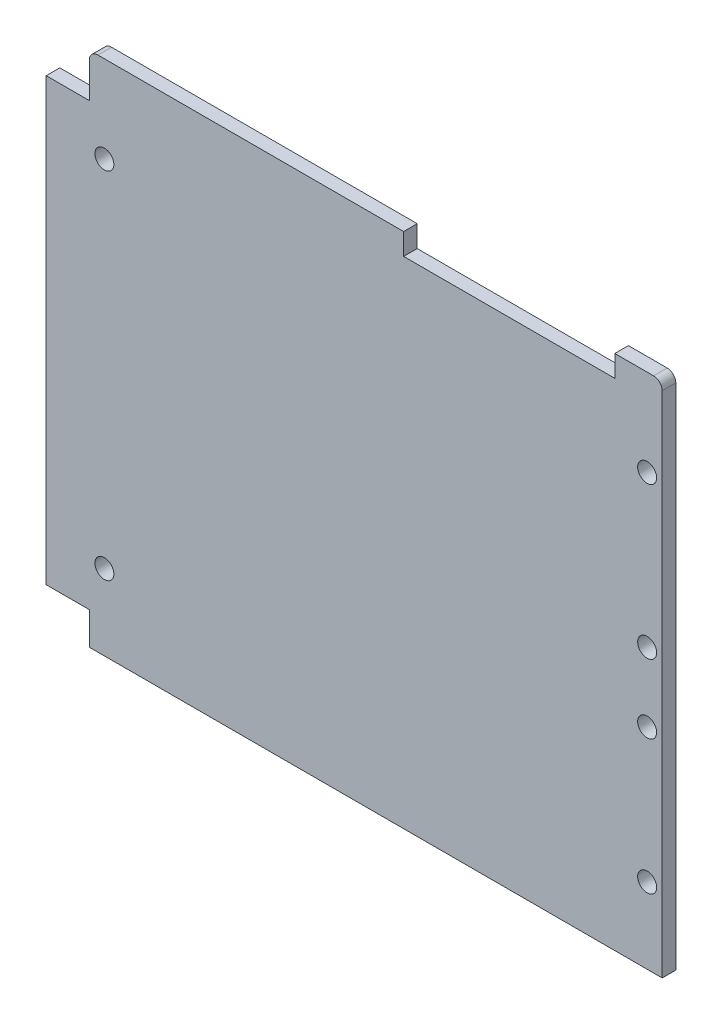
ISO-10303-21;
HEADER;
FILE_DESCRIPTION(('STEP AP214'),'2;1');
FILE_NAME('part.step','',(''),(''),'','','');
FILE_SCHEMA(('AUTOMOTIVE_DESIGN { 1 0 10303 214 1 1 1 1 }'));
ENDSEC;
DATA;
#1=APPLICATION_CONTEXT('core data for automotive mechanical design processes');
#2=APPLICATION_PROTOCOL_DEFINITION('international standard','automotive_design',2000,#1);
#3=PRODUCT_CONTEXT('',#1,'mechanical');
#4=PRODUCT('Part','Part','',(#3));
#5=PRODUCT_RELATED_PRODUCT_CATEGORY('part','',(#4));
#6=PRODUCT_DEFINITION_FORMATION('','',#4);
#7=PRODUCT_DEFINITION_CONTEXT('part definition',#1,'design');
#8=PRODUCT_DEFINITION('design','',#6,#7);
#9=PRODUCT_DEFINITION_SHAPE('','',#8);
#10=(LENGTH_UNIT() NAMED_UNIT(*) SI_UNIT(.MILLI.,.METRE.));
#11=(NAMED_UNIT(*) PLANE_ANGLE_UNIT() SI_UNIT($,.RADIAN.));
#12=(NAMED_UNIT(*) SI_UNIT($,.STERADIAN.) SOLID_ANGLE_UNIT());
#13=UNCERTAINTY_MEASURE_WITH_UNIT(LENGTH_MEASURE(1.E-05),#10,'distance_accuracy_value','');
#14=(GEOMETRIC_REPRESENTATION_CONTEXT(3) GLOBAL_UNCERTAINTY_ASSIGNED_CONTEXT((#13)) GLOBAL_UNIT_ASSIGNED_CONTEXT((#10,
#11,#12)) REPRESENTATION_CONTEXT('',''));
#15=CARTESIAN_POINT('',(0.,0.,0.));
#16=DIRECTION('',(0.,0.,1.));
#17=DIRECTION('',(1.,0.,0.));
#18=AXIS2_PLACEMENT_3D('',#15,#16,#17);
#19=CARTESIAN_POINT('',(50.0729843246072,67.1204329614403,-1.5748));
#20=DIRECTION('',(0.,1.,0.));
#21=DIRECTION('',(0.,0.,1.));
#22=AXIS2_PLACEMENT_3D('',#19,#20,#21);
#23=PLANE('',#22);
#24=DIRECTION('',(0.,0.,1.));
#25=VECTOR('',#24,1.);
#26=CARTESIAN_POINT('',(85.5429843246057,67.1204329614429,-1.575));
#27=LINE('',#26,#25);
#28=CARTESIAN_POINT('',(85.5429843246057,67.1204329614429,-1.5748));
#29=VERTEX_POINT('',#28);
#30=CARTESIAN_POINT('',(85.5429843246057,67.1204329614429,0.));
#31=VERTEX_POINT('',#30);
#32=EDGE_CURVE('E181',#29,#31,#27,.T.);
#33=ORIENTED_EDGE('',*,*,#32,.F.);
#34=DIRECTION('',(-1.,0.,0.));
#35=VECTOR('',#34,1.);
#36=CARTESIAN_POINT('',(50.0729843246072,67.1204329614403,-1.5748));
#37=LINE('',#36,#35);
#38=CARTESIAN_POINT('',(50.0729843246072,67.1204329614403,-1.5748));
#39=VERTEX_POINT('',#38);
#40=EDGE_CURVE('E289',#29,#39,#37,.T.);
#41=ORIENTED_EDGE('',*,*,#40,.T.);
#42=DIRECTION('',(0.,0.,1.));
#43=VECTOR('',#42,1.);
#44=CARTESIAN_POINT('',(50.0729843246072,67.1204329614403,-1.5748));
#45=LINE('',#44,#43);
#46=CARTESIAN_POINT('',(50.0729843246072,67.1204329614403,0.));
#47=VERTEX_POINT('',#46);
#48=EDGE_CURVE('E43',#39,#47,#45,.T.);
#49=ORIENTED_EDGE('',*,*,#48,.T.);
#50=DIRECTION('',(-1.,0.,0.));
#51=VECTOR('',#50,1.);
#52=CARTESIAN_POINT('',(50.0729843246072,67.1204329614403,0.));
#53=LINE('',#52,#51);
#54=EDGE_CURVE('E301',#31,#47,#53,.T.);
#55=ORIENTED_EDGE('',*,*,#54,.F.);
#56=EDGE_LOOP('',(#33,#41,#49,#55));
#57=FACE_BOUND('',#56,.T.);
#58=ADVANCED_FACE('F34',(#57),#23,.T.);
#59=CARTESIAN_POINT('',(49.0729843246072,66.1204329614403,-1.5748));
#60=DIRECTION('',(-1.,0.,0.));
#61=DIRECTION('',(0.,-1.,0.));
#62=AXIS2_PLACEMENT_3D('',#59,#60,#61);
#63=PLANE('',#62);
#64=DIRECTION('',(0.,0.,1.));
#65=VECTOR('',#64,1.);
#66=CARTESIAN_POINT('',(49.0729843245987,10.8954329614369,-1.575));
#67=LINE('',#66,#65);
#68=CARTESIAN_POINT('',(49.0729843245987,10.8954329614369,-1.575));
#69=VERTEX_POINT('',#68);
#70=CARTESIAN_POINT('',(49.0729843246072,10.8954329614369,0.));
#71=VERTEX_POINT('',#70);
#72=EDGE_CURVE('E211',#69,#71,#67,.T.);
#73=ORIENTED_EDGE('',*,*,#72,.F.);
#74=DIRECTION('',(0.,-1.,0.));
#75=VECTOR('',#74,1.);
#76=CARTESIAN_POINT('',(49.0729843246072,6.62043296144033,-1.575));
#77=LINE('',#76,#75);
#78=CARTESIAN_POINT('',(49.0729843246072,7.12043296144033,-1.575));
#79=VERTEX_POINT('',#78);
#80=EDGE_CURVE('E268',#69,#79,#77,.T.);
#81=ORIENTED_EDGE('',*,*,#80,.T.);
#82=DIRECTION('',(0.,0.,1.));
#83=VECTOR('',#82,1.);
#84=CARTESIAN_POINT('',(49.0729843246072,7.12043296144033,-1.575));
#85=LINE('',#84,#83);
#86=CARTESIAN_POINT('',(49.0729843246072,7.12043296144033,0.));
#87=VERTEX_POINT('',#86);
#88=EDGE_CURVE('E265',#79,#87,#85,.T.);
#89=ORIENTED_EDGE('',*,*,#88,.T.);
#90=DIRECTION('',(0.,-1.,0.));
#91=VECTOR('',#90,1.);
#92=CARTESIAN_POINT('',(49.0729843246072,66.1204329614403,0.));
#93=LINE('',#92,#91);
#94=EDGE_CURVE('E306',#71,#87,#93,.T.);
#95=ORIENTED_EDGE('',*,*,#94,.F.);
#96=EDGE_LOOP('',(#73,#81,#89,#95));
#97=FACE_BOUND('',#96,.T.);
#98=ADVANCED_FACE('F327',(#97),#63,.T.);
#99=DIRECTION('',(0.,0.,1.));
#100=VECTOR('',#99,1.);
#101=CARTESIAN_POINT('',(49.0729843245987,62.0454329614404,-1.575));
#102=LINE('',#101,#100);
#103=CARTESIAN_POINT('',(49.0729843246072,62.0454329614404,-1.5748));
#104=VERTEX_POINT('',#103);
#105=CARTESIAN_POINT('',(49.0729843246072,62.0454329614404,0.));
#106=VERTEX_POINT('',#105);
#107=EDGE_CURVE('E203',#104,#106,#102,.T.);
#108=ORIENTED_EDGE('',*,*,#107,.T.);
#109=CARTESIAN_POINT('',(49.0729843246072,66.1204329614403,0.));
#110=VERTEX_POINT('',#109);
#111=EDGE_CURVE('E286',#110,#106,#93,.T.);
#112=ORIENTED_EDGE('',*,*,#111,.F.);
#113=DIRECTION('',(0.,0.,1.));
#114=VECTOR('',#113,1.);
#115=CARTESIAN_POINT('',(49.0729843246072,66.1204329614403,-1.5748));
#116=LINE('',#115,#114);
#117=CARTESIAN_POINT('',(49.0729843246072,66.1204329614403,-1.5748));
#118=VERTEX_POINT('',#117);
#119=EDGE_CURVE('E11',#118,#110,#116,.T.);
#120=ORIENTED_EDGE('',*,*,#119,.F.);
#121=DIRECTION('',(0.,-1.,0.));
#122=VECTOR('',#121,1.);
#123=CARTESIAN_POINT('',(49.0729843246072,66.1204329614403,-1.5748));
#124=LINE('',#123,#122);
#125=EDGE_CURVE('E296',#118,#104,#124,.T.);
#126=ORIENTED_EDGE('',*,*,#125,.T.);
#127=EDGE_LOOP('',(#108,#112,#120,#126));
#128=FACE_BOUND('',#127,.T.);
#129=ADVANCED_FACE('F349',(#128),#63,.T.);
#130=CARTESIAN_POINT('',(50.0729843246072,66.1204329614403,-1.5748));
#131=DIRECTION('',(0.,0.,1.));
#132=DIRECTION('',(1.,0.,0.));
#133=AXIS2_PLACEMENT_3D('',#130,#131,#132);
#134=CYLINDRICAL_SURFACE('',#133,0.999999999999994);
#135=CARTESIAN_POINT('',(50.0729843246072,66.1204329614403,0.));
#136=DIRECTION('',(0.,0.,1.));
#137=DIRECTION('',(1.,0.,0.));
#138=AXIS2_PLACEMENT_3D('',#135,#136,#137);
#139=CIRCLE('',#138,0.999999999999994);
#140=EDGE_CURVE('E303',#47,#110,#139,.T.);
#141=ORIENTED_EDGE('',*,*,#140,.F.);
#142=ORIENTED_EDGE('',*,*,#48,.F.);
#143=CARTESIAN_POINT('',(50.0729843246072,66.1204329614403,-1.5748));
#144=DIRECTION('',(0.,0.,1.));
#145=DIRECTION('',(1.,0.,0.));
#146=AXIS2_PLACEMENT_3D('',#143,#144,#145);
#147=CIRCLE('',#146,0.999999999999994);
#148=EDGE_CURVE('E293',#39,#118,#147,.T.);
#149=ORIENTED_EDGE('',*,*,#148,.T.);
#150=ORIENTED_EDGE('',*,*,#119,.T.);
#151=EDGE_LOOP('',(#141,#142,#149,#150));
#152=FACE_BOUND('',#151,.T.);
#153=ADVANCED_FACE('F354',(#152),#134,.T.);
#154=DIRECTION('',(0.,0.,1.));
#155=VECTOR('',#154,1.);
#156=CARTESIAN_POINT('',(110.0429843246,67.1204329614429,-1.575));
#157=LINE('',#156,#155);
#158=CARTESIAN_POINT('',(110.0429843246,67.1204329614429,-1.5748));
#159=VERTEX_POINT('',#158);
#160=CARTESIAN_POINT('',(110.0429843246,67.1204329614429,0.));
#161=VERTEX_POINT('',#160);
#162=EDGE_CURVE('E163',#159,#161,#157,.T.);
#163=ORIENTED_EDGE('',*,*,#162,.T.);
#164=CARTESIAN_POINT('',(114.542984324607,67.1204329614403,0.));
#165=VERTEX_POINT('',#164);
#166=EDGE_CURVE('E176',#165,#161,#53,.T.);
#167=ORIENTED_EDGE('',*,*,#166,.F.);
#168=DIRECTION('',(0.,0.,1.));
#169=VECTOR('',#168,1.);
#170=CARTESIAN_POINT('',(114.542984324607,67.1204329614403,-1.5748));
#171=LINE('',#170,#169);
#172=CARTESIAN_POINT('',(114.542984324607,67.1204329614403,-1.5748));
#173=VERTEX_POINT('',#172);
#174=EDGE_CURVE('E310',#173,#165,#171,.T.);
#175=ORIENTED_EDGE('',*,*,#174,.F.);
#176=EDGE_CURVE('E290',#173,#159,#37,.T.);
#177=ORIENTED_EDGE('',*,*,#176,.T.);
#178=EDGE_LOOP('',(#163,#167,#175,#177));
#179=FACE_BOUND('',#178,.T.);
#180=ADVANCED_FACE('F390',(#179),#23,.T.);
#181=CARTESIAN_POINT('',(114.542984324607,66.1204329614403,-1.5748));
#182=DIRECTION('',(0.,0.,1.));
#183=DIRECTION('',(1.,0.,0.));
#184=AXIS2_PLACEMENT_3D('',#181,#182,#183);
#185=CYLINDRICAL_SURFACE('',#184,1.);
#186=CARTESIAN_POINT('',(114.542984324607,66.1204329614403,0.));
#187=DIRECTION('',(0.,0.,1.));
#188=DIRECTION('',(-1.,0.,0.));
#189=AXIS2_PLACEMENT_3D('',#186,#187,#188);
#190=CIRCLE('',#189,1.);
#191=CARTESIAN_POINT('',(115.542984324607,66.1204329614403,0.));
#192=VERTEX_POINT('',#191);
#193=EDGE_CURVE('E299',#192,#165,#190,.T.);
#194=ORIENTED_EDGE('',*,*,#193,.F.);
#195=DIRECTION('',(0.,0.,1.));
#196=VECTOR('',#195,1.);
#197=CARTESIAN_POINT('',(115.542984324607,66.1204329614403,-1.5748));
#198=LINE('',#197,#196);
#199=CARTESIAN_POINT('',(115.542984324607,66.1204329614403,-1.5748));
#200=VERTEX_POINT('',#199);
#201=EDGE_CURVE('E38',#200,#192,#198,.T.);
#202=ORIENTED_EDGE('',*,*,#201,.F.);
#203=CARTESIAN_POINT('',(114.542984324607,66.1204329614403,-1.5748));
#204=DIRECTION('',(0.,0.,1.));
#205=DIRECTION('',(-1.,0.,0.));
#206=AXIS2_PLACEMENT_3D('',#203,#204,#205);
#207=CIRCLE('',#206,1.);
#208=EDGE_CURVE('E285',#200,#173,#207,.T.);
#209=ORIENTED_EDGE('',*,*,#208,.T.);
#210=ORIENTED_EDGE('',*,*,#174,.T.);
#211=EDGE_LOOP('',(#194,#202,#209,#210));
#212=FACE_BOUND('',#211,.T.);
#213=ADVANCED_FACE('F320',(#212),#185,.T.);
#214=CARTESIAN_POINT('',(115.542984324607,66.1204329614403,-1.5748));
#215=DIRECTION('',(1.,0.,0.));
#216=DIRECTION('',(0.,1.,0.));
#217=AXIS2_PLACEMENT_3D('',#214,#215,#216);
#218=PLANE('',#217);
#219=DIRECTION('',(0.,0.,1.));
#220=VECTOR('',#219,1.);
#221=CARTESIAN_POINT('',(115.542984324607,7.12043296144033,-1.575));
#222=LINE('',#221,#220);
#223=CARTESIAN_POINT('',(115.542984324607,7.12043296144033,-1.575));
#224=VERTEX_POINT('',#223);
#225=CARTESIAN_POINT('',(115.542984324607,7.12043296144033,0.));
#226=VERTEX_POINT('',#225);
#227=EDGE_CURVE('E262',#224,#226,#222,.T.);
#228=ORIENTED_EDGE('',*,*,#227,.F.);
#229=DIRECTION('',(0.,1.,0.));
#230=VECTOR('',#229,1.);
#231=CARTESIAN_POINT('',(115.542984324607,6.62043296144033,-1.575));
#232=LINE('',#231,#230);
#233=CARTESIAN_POINT('',(115.542984324607,11.9563849575794,-1.575));
#234=VERTEX_POINT('',#233);
#235=EDGE_CURVE('E271',#224,#234,#232,.T.);
#236=ORIENTED_EDGE('',*,*,#235,.T.);
#237=DIRECTION('',(0.,0.,1.));
#238=VECTOR('',#237,1.);
#239=CARTESIAN_POINT('',(115.542984324607,11.9563849575794,-1.575));
#240=LINE('',#239,#238);
#241=CARTESIAN_POINT('',(115.542984324607,11.9563849575794,-1.5748));
#242=VERTEX_POINT('',#241);
#243=EDGE_CURVE('E275',#234,#242,#240,.T.);
#244=ORIENTED_EDGE('',*,*,#243,.T.);
#245=DIRECTION('',(0.,1.,0.));
#246=VECTOR('',#245,1.);
#247=CARTESIAN_POINT('',(115.542984324607,66.1204329614403,-1.5748));
#248=LINE('',#247,#246);
#249=EDGE_CURVE('E283',#242,#200,#248,.T.);
#250=ORIENTED_EDGE('',*,*,#249,.T.);
#251=ORIENTED_EDGE('',*,*,#201,.T.);
#252=DIRECTION('',(0.,1.,0.));
#253=VECTOR('',#252,1.);
#254=CARTESIAN_POINT('',(115.542984324607,66.1204329614403,0.));
#255=LINE('',#254,#253);
#256=EDGE_CURVE('E282',#226,#192,#255,.T.);
#257=ORIENTED_EDGE('',*,*,#256,.F.);
#258=EDGE_LOOP('',(#228,#236,#244,#250,#251,#257));
#259=FACE_BOUND('',#258,.T.);
#260=ADVANCED_FACE('F36',(#259),#218,.T.);
#261=CARTESIAN_POINT('',(114.542984324607,7.62043296144033,-1.5748));
#262=DIRECTION('',(0.,0.,1.));
#263=DIRECTION('',(1.,0.,0.));
#264=AXIS2_PLACEMENT_3D('',#261,#262,#263);
#265=PLANE('',#264);
#266=ORIENTED_EDGE('',*,*,#40,.F.);
#267=DIRECTION('',(0.,-1.,0.));
#268=VECTOR('',#267,1.);
#269=CARTESIAN_POINT('',(85.5429843246057,7.62043296144033,-1.5748));
#270=LINE('',#269,#268);
#271=CARTESIAN_POINT('',(85.5429843246057,64.620432961444,-1.5748));
#272=VERTEX_POINT('',#271);
#273=EDGE_CURVE('E187',#29,#272,#270,.T.);
#274=ORIENTED_EDGE('',*,*,#273,.T.);
#275=DIRECTION('',(1.,0.,0.));
#276=VECTOR('',#275,1.);
#277=CARTESIAN_POINT('',(114.542984324607,64.620432961444,-1.5748));
#278=LINE('',#277,#276);
#279=CARTESIAN_POINT('',(110.0429843246,64.620432961444,-1.5748));
#280=VERTEX_POINT('',#279);
#281=EDGE_CURVE('E183',#272,#280,#278,.T.);
#282=ORIENTED_EDGE('',*,*,#281,.T.);
#283=DIRECTION('',(0.,1.,0.));
#284=VECTOR('',#283,1.);
#285=CARTESIAN_POINT('',(110.0429843246,7.62043296144033,-1.5748));
#286=LINE('',#285,#284);
#287=EDGE_CURVE('E160',#280,#159,#286,.T.);
#288=ORIENTED_EDGE('',*,*,#287,.T.);
#289=ORIENTED_EDGE('',*,*,#176,.F.);
#290=ORIENTED_EDGE('',*,*,#208,.F.);
#291=ORIENTED_EDGE('',*,*,#249,.F.);
#292=DIRECTION('',(-1.,0.,0.));
#293=VECTOR('',#292,1.);
#294=CARTESIAN_POINT('',(114.542984324607,11.9563849575794,-1.5748));
#295=LINE('',#294,#293);
#296=CARTESIAN_POINT('',(49.0729843246072,11.9563849575794,-1.5748));
#297=VERTEX_POINT('',#296);
#298=EDGE_CURVE('E278',#242,#297,#295,.T.);
#299=ORIENTED_EDGE('',*,*,#298,.T.);
#300=DIRECTION('',(0.,1.,0.));
#301=VECTOR('',#300,1.);
#302=CARTESIAN_POINT('',(49.0729843245987,7.62043296144033,-1.5748));
#303=LINE('',#302,#301);
#304=EDGE_CURVE('E59',#297,#104,#303,.T.);
#305=ORIENTED_EDGE('',*,*,#304,.T.);
#306=ORIENTED_EDGE('',*,*,#125,.F.);
#307=ORIENTED_EDGE('',*,*,#148,.F.);
#308=EDGE_LOOP('',(#266,#274,#282,#288,#289,#290,#291,#299,#305,#306,#307));
#309=FACE_BOUND('',#308,.T.);
#310=CARTESIAN_POINT('',(50.8229843246072,15.8954329614404,-1.5748));
#311=DIRECTION('',(0.,0.,1.));
#312=DIRECTION('',(1.,0.,0.));
#313=AXIS2_PLACEMENT_3D('',#310,#311,#312);
#314=CIRCLE('',#313,1.09999999999999);
#315=CARTESIAN_POINT('',(51.9229843246072,15.8954329614404,-1.5748));
#316=VERTEX_POINT('',#315);
#317=EDGE_CURVE('E225',#316,#316,#314,.T.);
#318=ORIENTED_EDGE('',*,*,#317,.T.);
#319=EDGE_LOOP('',(#318));
#320=FACE_BOUND('',#319,.T.);
#321=CARTESIAN_POINT('',(50.8229843246072,57.0454329614403,-1.5748));
#322=DIRECTION('',(0.,0.,1.));
#323=DIRECTION('',(1.,0.,0.));
#324=AXIS2_PLACEMENT_3D('',#321,#322,#323);
#325=CIRCLE('',#324,1.09999999999999);
#326=CARTESIAN_POINT('',(51.9229843246072,57.0454329614403,-1.5748));
#327=VERTEX_POINT('',#326);
#328=EDGE_CURVE('E231',#327,#327,#325,.T.);
#329=ORIENTED_EDGE('',*,*,#328,.T.);
#330=EDGE_LOOP('',(#329));
#331=FACE_BOUND('',#330,.T.);
#332=CARTESIAN_POINT('',(113.792984324607,57.0454329614403,-1.5748));
#333=DIRECTION('',(0.,0.,1.));
#334=DIRECTION('',(1.,0.,0.));
#335=AXIS2_PLACEMENT_3D('',#332,#333,#334);
#336=CIRCLE('',#335,1.09999999999999);
#337=CARTESIAN_POINT('',(114.892984324607,57.0454329614403,-1.5748));
#338=VERTEX_POINT('',#337);
#339=EDGE_CURVE('E237',#338,#338,#336,.T.);
#340=ORIENTED_EDGE('',*,*,#339,.T.);
#341=EDGE_LOOP('',(#340));
#342=FACE_BOUND('',#341,.T.);
#343=CARTESIAN_POINT('',(113.792984324607,39.4704329614403,-1.5748));
#344=DIRECTION('',(0.,0.,1.));
#345=DIRECTION('',(1.,0.,0.));
#346=AXIS2_PLACEMENT_3D('',#343,#344,#345);
#347=CIRCLE('',#346,1.09999999999999);
#348=CARTESIAN_POINT('',(114.892984324607,39.4704329614403,-1.5748));
#349=VERTEX_POINT('',#348);
#350=EDGE_CURVE('E243',#349,#349,#347,.T.);
#351=ORIENTED_EDGE('',*,*,#350,.T.);
#352=EDGE_LOOP('',(#351));
#353=FACE_BOUND('',#352,.T.);
#354=CARTESIAN_POINT('',(113.792984324607,15.8954329614404,-1.5748));
#355=DIRECTION('',(0.,0.,1.));
#356=DIRECTION('',(1.,0.,0.));
#357=AXIS2_PLACEMENT_3D('',#354,#355,#356);
#358=CIRCLE('',#357,1.09999999999999);
#359=CARTESIAN_POINT('',(114.892984324607,15.8954329614404,-1.5748));
#360=VERTEX_POINT('',#359);
#361=EDGE_CURVE('E249',#360,#360,#358,.T.);
#362=ORIENTED_EDGE('',*,*,#361,.T.);
#363=EDGE_LOOP('',(#362));
#364=FACE_BOUND('',#363,.T.);
#365=CARTESIAN_POINT('',(113.792984324607,31.4704329614403,-1.5748));
#366=DIRECTION('',(0.,0.,1.));
#367=DIRECTION('',(1.,0.,0.));
#368=AXIS2_PLACEMENT_3D('',#365,#366,#367);
#369=CIRCLE('',#368,1.09999999999999);
#370=CARTESIAN_POINT('',(114.892984324607,31.4704329614403,-1.5748));
#371=VERTEX_POINT('',#370);
#372=EDGE_CURVE('E255',#371,#371,#369,.T.);
#373=ORIENTED_EDGE('',*,*,#372,.T.);
#374=EDGE_LOOP('',(#373));
#375=FACE_BOUND('',#374,.T.);
#376=ADVANCED_FACE('F357',(#309,#320,#331,#342,#353,#364,#375),#265,.F.);
#377=CARTESIAN_POINT('',(114.542984324607,7.62043296144033,0.));
#378=DIRECTION('',(0.,0.,1.));
#379=DIRECTION('',(1.,0.,0.));
#380=AXIS2_PLACEMENT_3D('',#377,#378,#379);
#381=PLANE('',#380);
#382=DIRECTION('',(0.,-1.,0.));
#383=VECTOR('',#382,1.);
#384=CARTESIAN_POINT('',(85.5429843246057,64.620432961444,0.));
#385=LINE('',#384,#383);
#386=CARTESIAN_POINT('',(85.5429843246057,64.620432961444,0.));
#387=VERTEX_POINT('',#386);
#388=EDGE_CURVE('E51',#31,#387,#385,.T.);
#389=ORIENTED_EDGE('',*,*,#388,.F.);
#390=ORIENTED_EDGE('',*,*,#54,.T.);
#391=ORIENTED_EDGE('',*,*,#140,.T.);
#392=ORIENTED_EDGE('',*,*,#111,.T.);
#393=DIRECTION('',(-1.,0.,0.));
#394=VECTOR('',#393,1.);
#395=CARTESIAN_POINT('',(49.0729843245987,62.0454329614404,0.));
#396=LINE('',#395,#394);
#397=CARTESIAN_POINT('',(44.0729843246038,62.0454329614404,0.));
#398=VERTEX_POINT('',#397);
#399=EDGE_CURVE('E190',#106,#398,#396,.T.);
#400=ORIENTED_EDGE('',*,*,#399,.T.);
#401=DIRECTION('',(0.,-1.,0.));
#402=VECTOR('',#401,1.);
#403=CARTESIAN_POINT('',(44.0729843246038,62.0454329614404,0.));
#404=LINE('',#403,#402);
#405=CARTESIAN_POINT('',(44.0729843246038,10.8954329614369,0.));
#406=VERTEX_POINT('',#405);
#407=EDGE_CURVE('E206',#398,#406,#404,.T.);
#408=ORIENTED_EDGE('',*,*,#407,.T.);
#409=DIRECTION('',(1.,0.,0.));
#410=VECTOR('',#409,1.);
#411=CARTESIAN_POINT('',(49.0729843245987,10.8954329614369,0.));
#412=LINE('',#411,#410);
#413=EDGE_CURVE('E194',#406,#71,#412,.T.);
#414=ORIENTED_EDGE('',*,*,#413,.T.);
#415=ORIENTED_EDGE('',*,*,#94,.T.);
#416=DIRECTION('',(-1.,0.,0.));
#417=VECTOR('',#416,1.);
#418=CARTESIAN_POINT('',(49.0729843246072,7.12043296144033,0.));
#419=LINE('',#418,#417);
#420=EDGE_CURVE('E258',#226,#87,#419,.T.);
#421=ORIENTED_EDGE('',*,*,#420,.F.);
#422=ORIENTED_EDGE('',*,*,#256,.T.);
#423=ORIENTED_EDGE('',*,*,#193,.T.);
#424=ORIENTED_EDGE('',*,*,#166,.T.);
#425=DIRECTION('',(0.,1.,0.));
#426=VECTOR('',#425,1.);
#427=CARTESIAN_POINT('',(110.0429843246,64.620432961444,0.));
#428=LINE('',#427,#426);
#429=CARTESIAN_POINT('',(110.0429843246,64.620432961444,0.));
#430=VERTEX_POINT('',#429);
#431=EDGE_CURVE('E157',#430,#161,#428,.T.);
#432=ORIENTED_EDGE('',*,*,#431,.F.);
#433=DIRECTION('',(1.,0.,0.));
#434=VECTOR('',#433,1.);
#435=CARTESIAN_POINT('',(85.5429843246057,64.620432961444,0.));
#436=LINE('',#435,#434);
#437=EDGE_CURVE('E167',#387,#430,#436,.T.);
#438=ORIENTED_EDGE('',*,*,#437,.F.);
#439=EDGE_LOOP('',(#389,#390,#391,#392,#400,#408,#414,#415,#421,#422,#423,#424,#432,#438));
#440=FACE_BOUND('',#439,.T.);
#441=CARTESIAN_POINT('',(50.8229843246072,15.8954329614404,0.));
#442=DIRECTION('',(0.,0.,-1.));
#443=DIRECTION('',(0.,1.,0.));
#444=AXIS2_PLACEMENT_3D('',#441,#442,#443);
#445=CIRCLE('',#444,1.09999999999999);
#446=CARTESIAN_POINT('',(50.8229843246072,16.9954329614404,0.));
#447=VERTEX_POINT('',#446);
#448=EDGE_CURVE('E222',#447,#447,#445,.T.);
#449=ORIENTED_EDGE('',*,*,#448,.T.);
#450=EDGE_LOOP('',(#449));
#451=FACE_BOUND('',#450,.T.);
#452=CARTESIAN_POINT('',(50.8229843246072,57.0454329614403,0.));
#453=DIRECTION('',(0.,0.,-1.));
#454=DIRECTION('',(0.,1.,0.));
#455=AXIS2_PLACEMENT_3D('',#452,#453,#454);
#456=CIRCLE('',#455,1.09999999999999);
#457=CARTESIAN_POINT('',(50.8229843246072,58.1454329614403,0.));
#458=VERTEX_POINT('',#457);
#459=EDGE_CURVE('E228',#458,#458,#456,.T.);
#460=ORIENTED_EDGE('',*,*,#459,.T.);
#461=EDGE_LOOP('',(#460));
#462=FACE_BOUND('',#461,.T.);
#463=CARTESIAN_POINT('',(113.792984324607,57.0454329614403,0.));
#464=DIRECTION('',(0.,0.,-1.));
#465=DIRECTION('',(0.,1.,0.));
#466=AXIS2_PLACEMENT_3D('',#463,#464,#465);
#467=CIRCLE('',#466,1.09999999999999);
#468=CARTESIAN_POINT('',(113.792984324607,58.1454329614403,0.));
#469=VERTEX_POINT('',#468);
#470=EDGE_CURVE('E234',#469,#469,#467,.T.);
#471=ORIENTED_EDGE('',*,*,#470,.T.);
#472=EDGE_LOOP('',(#471));
#473=FACE_BOUND('',#472,.T.);
#474=CARTESIAN_POINT('',(113.792984324607,39.4704329614403,0.));
#475=DIRECTION('',(0.,0.,-1.));
#476=DIRECTION('',(0.,1.,0.));
#477=AXIS2_PLACEMENT_3D('',#474,#475,#476);
#478=CIRCLE('',#477,1.09999999999999);
#479=CARTESIAN_POINT('',(113.792984324607,40.5704329614403,0.));
#480=VERTEX_POINT('',#479);
#481=EDGE_CURVE('E240',#480,#480,#478,.T.);
#482=ORIENTED_EDGE('',*,*,#481,.T.);
#483=EDGE_LOOP('',(#482));
#484=FACE_BOUND('',#483,.T.);
#485=CARTESIAN_POINT('',(113.792984324607,15.8954329614404,0.));
#486=DIRECTION('',(0.,0.,-1.));
#487=DIRECTION('',(0.,1.,0.));
#488=AXIS2_PLACEMENT_3D('',#485,#486,#487);
#489=CIRCLE('',#488,1.09999999999999);
#490=CARTESIAN_POINT('',(113.792984324607,16.9954329614404,0.));
#491=VERTEX_POINT('',#490);
#492=EDGE_CURVE('E246',#491,#491,#489,.T.);
#493=ORIENTED_EDGE('',*,*,#492,.T.);
#494=EDGE_LOOP('',(#493));
#495=FACE_BOUND('',#494,.T.);
#496=CARTESIAN_POINT('',(113.792984324607,31.4704329614403,0.));
#497=DIRECTION('',(0.,0.,-1.));
#498=DIRECTION('',(0.,1.,0.));
#499=AXIS2_PLACEMENT_3D('',#496,#497,#498);
#500=CIRCLE('',#499,1.09999999999999);
#501=CARTESIAN_POINT('',(113.792984324607,32.5704329614403,0.));
#502=VERTEX_POINT('',#501);
#503=EDGE_CURVE('E252',#502,#502,#500,.T.);
#504=ORIENTED_EDGE('',*,*,#503,.T.);
#505=EDGE_LOOP('',(#504));
#506=FACE_BOUND('',#505,.T.);
#507=ADVANCED_FACE('F172',(#440,#451,#462,#473,#484,#495,#506),#381,.T.);
#508=CARTESIAN_POINT('',(49.0729843246072,11.9563849575794,-1.575));
#509=DIRECTION('',(0.,1.,0.));
#510=DIRECTION('',(0.,0.,1.));
#511=AXIS2_PLACEMENT_3D('',#508,#509,#510);
#512=PLANE('',#511);
#513=ORIENTED_EDGE('',*,*,#298,.F.);
#514=ORIENTED_EDGE('',*,*,#243,.F.);
#515=DIRECTION('',(-1.,0.,0.));
#516=VECTOR('',#515,1.);
#517=CARTESIAN_POINT('',(49.0729843246072,11.9563849575794,-1.575));
#518=LINE('',#517,#516);
#519=CARTESIAN_POINT('',(49.0729843246072,11.9563849575794,-1.575));
#520=VERTEX_POINT('',#519);
#521=EDGE_CURVE('E273',#234,#520,#518,.T.);
#522=ORIENTED_EDGE('',*,*,#521,.T.);
#523=DIRECTION('',(0.,0.,1.));
#524=VECTOR('',#523,1.);
#525=CARTESIAN_POINT('',(49.0729843246072,11.9563849575794,-1.575));
#526=LINE('',#525,#524);
#527=EDGE_CURVE('E276',#520,#297,#526,.T.);
#528=ORIENTED_EDGE('',*,*,#527,.T.);
#529=EDGE_LOOP('',(#513,#514,#522,#528));
#530=FACE_BOUND('',#529,.T.);
#531=ADVANCED_FACE('F336',(#530),#512,.T.);
#532=CARTESIAN_POINT('',(0.,0.,-1.575));
#533=DIRECTION('',(0.,0.,-1.));
#534=DIRECTION('',(-1.,0.,0.));
#535=AXIS2_PLACEMENT_3D('',#532,#533,#534);
#536=PLANE('',#535);
#537=DIRECTION('',(-1.,0.,0.));
#538=VECTOR('',#537,1.);
#539=CARTESIAN_POINT('',(49.0729843246072,7.12043296144033,-1.575));
#540=LINE('',#539,#538);
#541=EDGE_CURVE('E259',#224,#79,#540,.T.);
#542=ORIENTED_EDGE('',*,*,#541,.T.);
#543=ORIENTED_EDGE('',*,*,#80,.F.);
#544=DIRECTION('',(1.,0.,0.));
#545=VECTOR('',#544,1.);
#546=CARTESIAN_POINT('',(49.0729843245987,10.8954329614369,-1.575));
#547=LINE('',#546,#545);
#548=CARTESIAN_POINT('',(44.0729843246038,10.8954329614369,-1.575));
#549=VERTEX_POINT('',#548);
#550=EDGE_CURVE('E200',#549,#69,#547,.T.);
#551=ORIENTED_EDGE('',*,*,#550,.F.);
#552=DIRECTION('',(0.,-1.,0.));
#553=VECTOR('',#552,1.);
#554=CARTESIAN_POINT('',(44.0729843246038,62.0454329614404,-1.575));
#555=LINE('',#554,#553);
#556=CARTESIAN_POINT('',(44.0729843246038,62.0454329614404,-1.575));
#557=VERTEX_POINT('',#556);
#558=EDGE_CURVE('E197',#557,#549,#555,.T.);
#559=ORIENTED_EDGE('',*,*,#558,.F.);
#560=DIRECTION('',(-1.,0.,0.));
#561=VECTOR('',#560,1.);
#562=CARTESIAN_POINT('',(49.0729843245987,62.0454329614404,-1.575));
#563=LINE('',#562,#561);
#564=CARTESIAN_POINT('',(49.0729843245987,62.0454329614404,-1.575));
#565=VERTEX_POINT('',#564);
#566=EDGE_CURVE('E193',#565,#557,#563,.T.);
#567=ORIENTED_EDGE('',*,*,#566,.F.);
#568=DIRECTION('',(0.,1.,0.));
#569=VECTOR('',#568,1.);
#570=CARTESIAN_POINT('',(49.0729843245987,62.0454329614404,-1.575));
#571=LINE('',#570,#569);
#572=EDGE_CURVE('E191',#520,#565,#571,.T.);
#573=ORIENTED_EDGE('',*,*,#572,.F.);
#574=ORIENTED_EDGE('',*,*,#521,.F.);
#575=ORIENTED_EDGE('',*,*,#235,.F.);
#576=EDGE_LOOP('',(#542,#543,#551,#559,#567,#573,#574,#575));
#577=FACE_BOUND('',#576,.T.);
#578=ADVANCED_FACE('F330',(#577),#536,.T.);
#579=CARTESIAN_POINT('',(49.0729843246072,7.12043296144033,-1.575));
#580=DIRECTION('',(0.,1.,0.));
#581=DIRECTION('',(0.,0.,1.));
#582=AXIS2_PLACEMENT_3D('',#579,#580,#581);
#583=PLANE('',#582);
#584=ORIENTED_EDGE('',*,*,#420,.T.);
#585=ORIENTED_EDGE('',*,*,#88,.F.);
#586=ORIENTED_EDGE('',*,*,#541,.F.);
#587=ORIENTED_EDGE('',*,*,#227,.T.);
#588=EDGE_LOOP('',(#584,#585,#586,#587));
#589=FACE_BOUND('',#588,.T.);
#590=ADVANCED_FACE('F324',(#589),#583,.F.);
#591=CARTESIAN_POINT('',(113.792984324607,31.4704329614403,-6.57479999999998));
#592=DIRECTION('',(0.,0.,-1.));
#593=DIRECTION('',(0.,1.,0.));
#594=AXIS2_PLACEMENT_3D('',#591,#592,#593);
#595=CYLINDRICAL_SURFACE('',#594,1.09999999999999);
#596=ORIENTED_EDGE('',*,*,#503,.F.);
#597=EDGE_LOOP('',(#596));
#598=FACE_BOUND('',#597,.T.);
#599=ORIENTED_EDGE('',*,*,#372,.F.);
#600=EDGE_LOOP('',(#599));
#601=FACE_BOUND('',#600,.T.);
#602=ADVANCED_FACE('F373',(#598,#601),#595,.F.);
#603=CARTESIAN_POINT('',(113.792984324607,15.8954329614404,-6.57479999999998));
#604=DIRECTION('',(0.,0.,-1.));
#605=DIRECTION('',(0.,1.,0.));
#606=AXIS2_PLACEMENT_3D('',#603,#604,#605);
#607=CYLINDRICAL_SURFACE('',#606,1.09999999999999);
#608=ORIENTED_EDGE('',*,*,#492,.F.);
#609=EDGE_LOOP('',(#608));
#610=FACE_BOUND('',#609,.T.);
#611=ORIENTED_EDGE('',*,*,#361,.F.);
#612=EDGE_LOOP('',(#611));
#613=FACE_BOUND('',#612,.T.);
#614=ADVANCED_FACE('F375',(#610,#613),#607,.F.);
#615=CARTESIAN_POINT('',(113.792984324607,39.4704329614403,-6.57479999999998));
#616=DIRECTION('',(0.,0.,-1.));
#617=DIRECTION('',(0.,1.,0.));
#618=AXIS2_PLACEMENT_3D('',#615,#616,#617);
#619=CYLINDRICAL_SURFACE('',#618,1.09999999999999);
#620=ORIENTED_EDGE('',*,*,#481,.F.);
#621=EDGE_LOOP('',(#620));
#622=FACE_BOUND('',#621,.T.);
#623=ORIENTED_EDGE('',*,*,#350,.F.);
#624=EDGE_LOOP('',(#623));
#625=FACE_BOUND('',#624,.T.);
#626=ADVANCED_FACE('F382',(#622,#625),#619,.F.);
#627=CARTESIAN_POINT('',(113.792984324607,57.0454329614403,-6.57479999999998));
#628=DIRECTION('',(0.,0.,-1.));
#629=DIRECTION('',(0.,1.,0.));
#630=AXIS2_PLACEMENT_3D('',#627,#628,#629);
#631=CYLINDRICAL_SURFACE('',#630,1.09999999999999);
#632=ORIENTED_EDGE('',*,*,#470,.F.);
#633=EDGE_LOOP('',(#632));
#634=FACE_BOUND('',#633,.T.);
#635=ORIENTED_EDGE('',*,*,#339,.F.);
#636=EDGE_LOOP('',(#635));
#637=FACE_BOUND('',#636,.T.);
#638=ADVANCED_FACE('F432',(#634,#637),#631,.F.);
#639=CARTESIAN_POINT('',(50.8229843246072,57.0454329614403,-6.57479999999997));
#640=DIRECTION('',(0.,0.,-1.));
#641=DIRECTION('',(0.,1.,0.));
#642=AXIS2_PLACEMENT_3D('',#639,#640,#641);
#643=CYLINDRICAL_SURFACE('',#642,1.09999999999999);
#644=ORIENTED_EDGE('',*,*,#459,.F.);
#645=EDGE_LOOP('',(#644));
#646=FACE_BOUND('',#645,.T.);
#647=ORIENTED_EDGE('',*,*,#328,.F.);
#648=EDGE_LOOP('',(#647));
#649=FACE_BOUND('',#648,.T.);
#650=ADVANCED_FACE('F428',(#646,#649),#643,.F.);
#651=CARTESIAN_POINT('',(50.8229843246072,15.8954329614404,-6.57479999999997));
#652=DIRECTION('',(0.,0.,-1.));
#653=DIRECTION('',(0.,1.,0.));
#654=AXIS2_PLACEMENT_3D('',#651,#652,#653);
#655=CYLINDRICAL_SURFACE('',#654,1.09999999999999);
#656=ORIENTED_EDGE('',*,*,#448,.F.);
#657=EDGE_LOOP('',(#656));
#658=FACE_BOUND('',#657,.T.);
#659=ORIENTED_EDGE('',*,*,#317,.F.);
#660=EDGE_LOOP('',(#659));
#661=FACE_BOUND('',#660,.T.);
#662=ADVANCED_FACE('F425',(#658,#661),#655,.F.);
#663=CARTESIAN_POINT('',(49.0729843245987,62.0454329614404,-1.575));
#664=DIRECTION('',(1.,0.,0.));
#665=DIRECTION('',(0.,0.,-1.));
#666=AXIS2_PLACEMENT_3D('',#663,#664,#665);
#667=PLANE('',#666);
#668=ORIENTED_EDGE('',*,*,#304,.F.);
#669=ORIENTED_EDGE('',*,*,#527,.F.);
#670=ORIENTED_EDGE('',*,*,#572,.T.);
#671=EDGE_CURVE('E218',#565,#104,#102,.T.);
#672=ORIENTED_EDGE('',*,*,#671,.T.);
#673=EDGE_LOOP('',(#668,#669,#670,#672));
#674=FACE_BOUND('',#673,.T.);
#675=ADVANCED_FACE('F342',(#674),#667,.T.);
#676=CARTESIAN_POINT('',(49.0729843245987,10.8954329614369,-1.575));
#677=DIRECTION('',(0.,-1.,0.));
#678=DIRECTION('',(0.,0.,-1.));
#679=AXIS2_PLACEMENT_3D('',#676,#677,#678);
#680=PLANE('',#679);
#681=ORIENTED_EDGE('',*,*,#413,.F.);
#682=DIRECTION('',(0.,0.,1.));
#683=VECTOR('',#682,1.);
#684=CARTESIAN_POINT('',(44.0729843246038,10.8954329614369,-1.575));
#685=LINE('',#684,#683);
#686=EDGE_CURVE('E214',#549,#406,#685,.T.);
#687=ORIENTED_EDGE('',*,*,#686,.F.);
#688=ORIENTED_EDGE('',*,*,#550,.T.);
#689=ORIENTED_EDGE('',*,*,#72,.T.);
#690=EDGE_LOOP('',(#681,#687,#688,#689));
#691=FACE_BOUND('',#690,.T.);
#692=ADVANCED_FACE('F416',(#691),#680,.T.);
#693=CARTESIAN_POINT('',(44.0729843246038,62.0454329614404,-1.575));
#694=DIRECTION('',(-1.,0.,0.));
#695=DIRECTION('',(0.,0.,1.));
#696=AXIS2_PLACEMENT_3D('',#693,#694,#695);
#697=PLANE('',#696);
#698=ORIENTED_EDGE('',*,*,#407,.F.);
#699=DIRECTION('',(0.,0.,1.));
#700=VECTOR('',#699,1.);
#701=CARTESIAN_POINT('',(44.0729843246038,62.0454329614404,-1.575));
#702=LINE('',#701,#700);
#703=EDGE_CURVE('E216',#557,#398,#702,.T.);
#704=ORIENTED_EDGE('',*,*,#703,.F.);
#705=ORIENTED_EDGE('',*,*,#558,.T.);
#706=ORIENTED_EDGE('',*,*,#686,.T.);
#707=EDGE_LOOP('',(#698,#704,#705,#706));
#708=FACE_BOUND('',#707,.T.);
#709=ADVANCED_FACE('F412',(#708),#697,.T.);
#710=CARTESIAN_POINT('',(49.0729843245987,62.0454329614404,-1.575));
#711=DIRECTION('',(0.,1.,0.));
#712=DIRECTION('',(0.,0.,1.));
#713=AXIS2_PLACEMENT_3D('',#710,#711,#712);
#714=PLANE('',#713);
#715=ORIENTED_EDGE('',*,*,#399,.F.);
#716=ORIENTED_EDGE('',*,*,#107,.F.);
#717=ORIENTED_EDGE('',*,*,#671,.F.);
#718=ORIENTED_EDGE('',*,*,#566,.T.);
#719=ORIENTED_EDGE('',*,*,#703,.T.);
#720=EDGE_LOOP('',(#715,#716,#717,#718,#719));
#721=FACE_BOUND('',#720,.T.);
#722=ADVANCED_FACE('F346',(#721),#714,.T.);
#723=CARTESIAN_POINT('',(85.5429843246057,64.620432961444,-1.575));
#724=DIRECTION('',(-1.,0.,0.));
#725=DIRECTION('',(0.,0.,1.));
#726=AXIS2_PLACEMENT_3D('',#723,#724,#725);
#727=PLANE('',#726);
#728=ORIENTED_EDGE('',*,*,#32,.T.);
#729=ORIENTED_EDGE('',*,*,#388,.T.);
#730=DIRECTION('',(0.,0.,1.));
#731=VECTOR('',#730,1.);
#732=CARTESIAN_POINT('',(85.5429843246057,64.620432961444,-1.575));
#733=LINE('',#732,#731);
#734=EDGE_CURVE('E164',#272,#387,#733,.T.);
#735=ORIENTED_EDGE('',*,*,#734,.F.);
#736=ORIENTED_EDGE('',*,*,#273,.F.);
#737=EDGE_LOOP('',(#728,#729,#735,#736));
#738=FACE_BOUND('',#737,.T.);
#739=ADVANCED_FACE('F404',(#738),#727,.F.);
#740=CARTESIAN_POINT('',(110.0429843246,64.620432961444,-1.575));
#741=DIRECTION('',(1.,0.,0.));
#742=DIRECTION('',(0.,0.,-1.));
#743=AXIS2_PLACEMENT_3D('',#740,#741,#742);
#744=PLANE('',#743);
#745=DIRECTION('',(0.,0.,1.));
#746=VECTOR('',#745,1.);
#747=CARTESIAN_POINT('',(110.0429843246,64.620432961444,-1.575));
#748=LINE('',#747,#746);
#749=EDGE_CURVE('E153',#280,#430,#748,.T.);
#750=ORIENTED_EDGE('',*,*,#749,.T.);
#751=ORIENTED_EDGE('',*,*,#431,.T.);
#752=ORIENTED_EDGE('',*,*,#162,.F.);
#753=ORIENTED_EDGE('',*,*,#287,.F.);
#754=EDGE_LOOP('',(#750,#751,#752,#753));
#755=FACE_BOUND('',#754,.T.);
#756=ADVANCED_FACE('F155',(#755),#744,.F.);
#757=CARTESIAN_POINT('',(85.5429843246057,64.620432961444,-1.575));
#758=DIRECTION('',(0.,-1.,0.));
#759=DIRECTION('',(0.,0.,-1.));
#760=AXIS2_PLACEMENT_3D('',#757,#758,#759);
#761=PLANE('',#760);
#762=ORIENTED_EDGE('',*,*,#734,.T.);
#763=ORIENTED_EDGE('',*,*,#437,.T.);
#764=ORIENTED_EDGE('',*,*,#749,.F.);
#765=ORIENTED_EDGE('',*,*,#281,.F.);
#766=EDGE_LOOP('',(#762,#763,#764,#765));
#767=FACE_BOUND('',#766,.T.);
#768=ADVANCED_FACE('F168',(#767),#761,.F.);
#769=CLOSED_SHELL('',(#58,#98,#129,#153,#180,#213,#260,#376,#507,#531,#578,#590,#602,#614,#626,
#638,#650,#662,#675,#692,#709,#722,#739,#756,#768));
#770=MANIFOLD_SOLID_BREP('B2',#769);
#771=ADVANCED_BREP_SHAPE_REPRESENTATION('',(#18,#770),#14);
#772=SHAPE_DEFINITION_REPRESENTATION(#9,#771);
ENDSEC;
END-ISO-10303-21;
